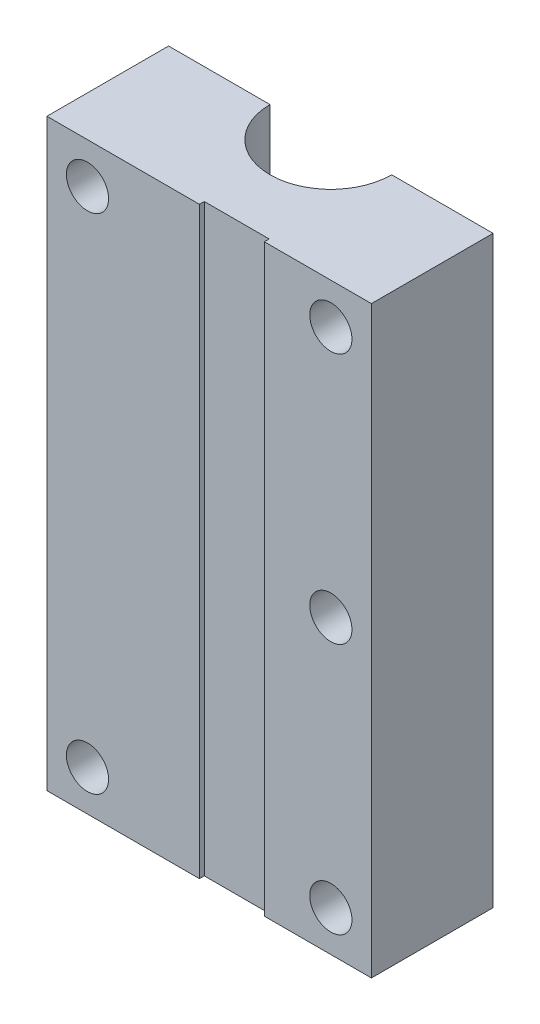
ISO-10303-21;
HEADER;
FILE_DESCRIPTION(('STEP AP214'),'2;1');
FILE_NAME('part.step','',(''),(''),'','','');
FILE_SCHEMA(('AUTOMOTIVE_DESIGN { 1 0 10303 214 1 1 1 1 }'));
ENDSEC;
DATA;
#1=APPLICATION_CONTEXT('core data for automotive mechanical design processes');
#2=APPLICATION_PROTOCOL_DEFINITION('international standard','automotive_design',2000,#1);
#3=PRODUCT_CONTEXT('',#1,'mechanical');
#4=PRODUCT('Part','Part','',(#3));
#5=PRODUCT_RELATED_PRODUCT_CATEGORY('part','',(#4));
#6=PRODUCT_DEFINITION_FORMATION('','',#4);
#7=PRODUCT_DEFINITION_CONTEXT('part definition',#1,'design');
#8=PRODUCT_DEFINITION('design','',#6,#7);
#9=PRODUCT_DEFINITION_SHAPE('','',#8);
#10=(LENGTH_UNIT() NAMED_UNIT(*) SI_UNIT(.MILLI.,.METRE.));
#11=(NAMED_UNIT(*) PLANE_ANGLE_UNIT() SI_UNIT($,.RADIAN.));
#12=(NAMED_UNIT(*) SI_UNIT($,.STERADIAN.) SOLID_ANGLE_UNIT());
#13=UNCERTAINTY_MEASURE_WITH_UNIT(LENGTH_MEASURE(1.E-05),#10,'distance_accuracy_value','');
#14=(GEOMETRIC_REPRESENTATION_CONTEXT(3) GLOBAL_UNCERTAINTY_ASSIGNED_CONTEXT((#13)) GLOBAL_UNIT_ASSIGNED_CONTEXT((#10,
#11,#12)) REPRESENTATION_CONTEXT('',''));
#15=CARTESIAN_POINT('',(0.,0.,0.));
#16=DIRECTION('',(0.,0.,1.));
#17=DIRECTION('',(1.,0.,0.));
#18=AXIS2_PLACEMENT_3D('',#15,#16,#17);
#19=CARTESIAN_POINT('',(0.,36.,0.));
#20=DIRECTION('',(0.,0.,-1.));
#21=DIRECTION('',(-1.,0.,0.));
#22=AXIS2_PLACEMENT_3D('',#19,#20,#21);
#23=PLANE('',#22);
#24=CARTESIAN_POINT('',(5.,-31.,0.));
#25=DIRECTION('',(0.,0.,1.));
#26=DIRECTION('',(1.,0.,0.));
#27=AXIS2_PLACEMENT_3D('',#24,#25,#26);
#28=CIRCLE('',#27,2.6);
#29=CARTESIAN_POINT('',(7.6,-31.,0.));
#30=VERTEX_POINT('',#29);
#31=EDGE_CURVE('E345',#30,#30,#28,.T.);
#32=ORIENTED_EDGE('',*,*,#31,.F.);
#33=EDGE_LOOP('',(#32));
#34=FACE_BOUND('',#33,.T.);
#35=CARTESIAN_POINT('',(5.,31.,0.));
#36=DIRECTION('',(0.,0.,1.));
#37=DIRECTION('',(1.,0.,0.));
#38=AXIS2_PLACEMENT_3D('',#35,#36,#37);
#39=CIRCLE('',#38,2.6);
#40=CARTESIAN_POINT('',(7.6,31.,0.));
#41=VERTEX_POINT('',#40);
#42=EDGE_CURVE('E359',#41,#41,#39,.T.);
#43=ORIENTED_EDGE('',*,*,#42,.F.);
#44=EDGE_LOOP('',(#43));
#45=FACE_BOUND('',#44,.T.);
#46=DIRECTION('',(1.,0.,0.));
#47=VECTOR('',#46,1.);
#48=CARTESIAN_POINT('',(0.,-36.,0.));
#49=LINE('',#48,#47);
#50=CARTESIAN_POINT('',(0.,-36.,0.));
#51=VERTEX_POINT('',#50);
#52=CARTESIAN_POINT('',(18.8,-36.,0.));
#53=VERTEX_POINT('',#52);
#54=EDGE_CURVE('E147',#51,#53,#49,.T.);
#55=ORIENTED_EDGE('',*,*,#54,.T.);
#56=DIRECTION('',(0.,-1.,0.));
#57=VECTOR('',#56,1.);
#58=CARTESIAN_POINT('',(18.8,38.3259144244949,0.));
#59=LINE('',#58,#57);
#60=CARTESIAN_POINT('',(18.8,36.,0.));
#61=VERTEX_POINT('',#60);
#62=EDGE_CURVE('E136',#61,#53,#59,.T.);
#63=ORIENTED_EDGE('',*,*,#62,.F.);
#64=DIRECTION('',(1.,0.,0.));
#65=VECTOR('',#64,1.);
#66=CARTESIAN_POINT('',(0.,36.,0.));
#67=LINE('',#66,#65);
#68=CARTESIAN_POINT('',(0.,36.,0.));
#69=VERTEX_POINT('',#68);
#70=EDGE_CURVE('E145',#69,#61,#67,.T.);
#71=ORIENTED_EDGE('',*,*,#70,.F.);
#72=DIRECTION('',(0.,-1.,0.));
#73=VECTOR('',#72,1.);
#74=CARTESIAN_POINT('',(0.,36.,0.));
#75=LINE('',#74,#73);
#76=EDGE_CURVE('E201',#69,#51,#75,.T.);
#77=ORIENTED_EDGE('',*,*,#76,.T.);
#78=EDGE_LOOP('',(#55,#63,#71,#77));
#79=FACE_BOUND('',#78,.T.);
#80=ADVANCED_FACE('F33',(#34,#45,#79),#23,.F.);
#81=CARTESIAN_POINT('',(27.5,36.,-15.));
#82=DIRECTION('',(0.,0.,1.));
#83=DIRECTION('',(1.,0.,0.));
#84=AXIS2_PLACEMENT_3D('',#81,#82,#83);
#85=PLANE('',#84);
#86=CARTESIAN_POINT('',(35.,0.,-15.));
#87=DIRECTION('',(0.,0.,1.));
#88=DIRECTION('',(1.,0.,0.));
#89=AXIS2_PLACEMENT_3D('',#86,#87,#88);
#90=CIRCLE('',#89,2.6);
#91=CARTESIAN_POINT('',(37.6,0.,-15.));
#92=VERTEX_POINT('',#91);
#93=EDGE_CURVE('E346',#92,#92,#90,.T.);
#94=ORIENTED_EDGE('',*,*,#93,.T.);
#95=EDGE_LOOP('',(#94));
#96=FACE_BOUND('',#95,.T.);
#97=CARTESIAN_POINT('',(35.,-31.,-15.));
#98=DIRECTION('',(0.,0.,1.));
#99=DIRECTION('',(1.,0.,0.));
#100=AXIS2_PLACEMENT_3D('',#97,#98,#99);
#101=CIRCLE('',#100,2.6);
#102=CARTESIAN_POINT('',(37.6,-31.,-15.));
#103=VERTEX_POINT('',#102);
#104=EDGE_CURVE('E363',#103,#103,#101,.T.);
#105=ORIENTED_EDGE('',*,*,#104,.T.);
#106=EDGE_LOOP('',(#105));
#107=FACE_BOUND('',#106,.T.);
#108=CARTESIAN_POINT('',(35.,31.,-15.));
#109=DIRECTION('',(0.,0.,1.));
#110=DIRECTION('',(1.,0.,0.));
#111=AXIS2_PLACEMENT_3D('',#108,#109,#110);
#112=CIRCLE('',#111,2.6);
#113=CARTESIAN_POINT('',(37.6,31.,-15.));
#114=VERTEX_POINT('',#113);
#115=EDGE_CURVE('E356',#114,#114,#112,.T.);
#116=ORIENTED_EDGE('',*,*,#115,.T.);
#117=EDGE_LOOP('',(#116));
#118=FACE_BOUND('',#117,.T.);
#119=DIRECTION('',(-1.,0.,0.));
#120=VECTOR('',#119,1.);
#121=CARTESIAN_POINT('',(8.45886159366972,-16.5,-15.));
#122=LINE('',#121,#120);
#123=CARTESIAN_POINT('',(31.4588615936697,-16.5,-15.));
#124=VERTEX_POINT('',#123);
#125=CARTESIAN_POINT('',(27.5,-16.5,-15.));
#126=VERTEX_POINT('',#125);
#127=EDGE_CURVE('E236',#124,#126,#122,.T.);
#128=ORIENTED_EDGE('',*,*,#127,.F.);
#129=DIRECTION('',(0.,1.,0.));
#130=VECTOR('',#129,1.);
#131=CARTESIAN_POINT('',(31.4588615936697,-16.5,-15.));
#132=LINE('',#131,#130);
#133=CARTESIAN_POINT('',(31.4588615936697,16.5,-15.));
#134=VERTEX_POINT('',#133);
#135=EDGE_CURVE('E239',#124,#134,#132,.T.);
#136=ORIENTED_EDGE('',*,*,#135,.T.);
#137=DIRECTION('',(-1.,0.,0.));
#138=VECTOR('',#137,1.);
#139=CARTESIAN_POINT('',(8.45886159366972,16.5,-15.));
#140=LINE('',#139,#138);
#141=CARTESIAN_POINT('',(27.5,16.5,-15.));
#142=VERTEX_POINT('',#141);
#143=EDGE_CURVE('E237',#134,#142,#140,.T.);
#144=ORIENTED_EDGE('',*,*,#143,.T.);
#145=DIRECTION('',(0.,-1.,0.));
#146=VECTOR('',#145,1.);
#147=CARTESIAN_POINT('',(27.5,36.,-15.));
#148=LINE('',#147,#146);
#149=CARTESIAN_POINT('',(27.5,36.,-15.));
#150=VERTEX_POINT('',#149);
#151=EDGE_CURVE('E192',#150,#142,#148,.T.);
#152=ORIENTED_EDGE('',*,*,#151,.F.);
#153=DIRECTION('',(-1.,0.,0.));
#154=VECTOR('',#153,1.);
#155=CARTESIAN_POINT('',(27.5,36.,-15.));
#156=LINE('',#155,#154);
#157=CARTESIAN_POINT('',(40.,36.,-15.));
#158=VERTEX_POINT('',#157);
#159=EDGE_CURVE('E158',#158,#150,#156,.T.);
#160=ORIENTED_EDGE('',*,*,#159,.F.);
#161=DIRECTION('',(0.,-1.,0.));
#162=VECTOR('',#161,1.);
#163=CARTESIAN_POINT('',(40.,36.,-15.));
#164=LINE('',#163,#162);
#165=CARTESIAN_POINT('',(40.,-36.,-15.));
#166=VERTEX_POINT('',#165);
#167=EDGE_CURVE('E195',#158,#166,#164,.T.);
#168=ORIENTED_EDGE('',*,*,#167,.T.);
#169=DIRECTION('',(-1.,0.,0.));
#170=VECTOR('',#169,1.);
#171=CARTESIAN_POINT('',(27.5,-36.,-15.));
#172=LINE('',#171,#170);
#173=CARTESIAN_POINT('',(27.5,-36.,-15.));
#174=VERTEX_POINT('',#173);
#175=EDGE_CURVE('E177',#166,#174,#172,.T.);
#176=ORIENTED_EDGE('',*,*,#175,.T.);
#177=EDGE_CURVE('E191',#126,#174,#148,.T.);
#178=ORIENTED_EDGE('',*,*,#177,.F.);
#179=EDGE_LOOP('',(#128,#136,#144,#152,#160,#168,#176,#178));
#180=FACE_BOUND('',#179,.T.);
#181=ADVANCED_FACE('F281',(#96,#107,#118,#180),#85,.F.);
#182=CARTESIAN_POINT('',(20.,36.,-15.));
#183=DIRECTION('',(0.,-1.,0.));
#184=DIRECTION('',(0.,0.,-1.));
#185=AXIS2_PLACEMENT_3D('',#182,#183,#184);
#186=CYLINDRICAL_SURFACE('',#185,7.5);
#187=CARTESIAN_POINT('',(20.,-16.5,-15.));
#188=DIRECTION('',(0.,1.,0.));
#189=DIRECTION('',(0.,0.,1.));
#190=AXIS2_PLACEMENT_3D('',#187,#188,#189);
#191=CIRCLE('',#190,7.5);
#192=CARTESIAN_POINT('',(12.5,-16.5,-15.));
#193=VERTEX_POINT('',#192);
#194=EDGE_CURVE('E173',#126,#193,#191,.F.);
#195=ORIENTED_EDGE('',*,*,#194,.F.);
#196=ORIENTED_EDGE('',*,*,#177,.T.);
#197=CARTESIAN_POINT('',(20.,-36.,-15.));
#198=DIRECTION('',(0.,-1.,0.));
#199=DIRECTION('',(0.,0.,1.));
#200=AXIS2_PLACEMENT_3D('',#197,#198,#199);
#201=CIRCLE('',#200,7.5);
#202=CARTESIAN_POINT('',(12.5,-36.,-15.));
#203=VERTEX_POINT('',#202);
#204=EDGE_CURVE('E180',#174,#203,#201,.T.);
#205=ORIENTED_EDGE('',*,*,#204,.T.);
#206=DIRECTION('',(0.,-1.,0.));
#207=VECTOR('',#206,1.);
#208=CARTESIAN_POINT('',(12.5,36.,-15.));
#209=LINE('',#208,#207);
#210=EDGE_CURVE('E187',#193,#203,#209,.T.);
#211=ORIENTED_EDGE('',*,*,#210,.F.);
#212=EDGE_LOOP('',(#195,#196,#205,#211));
#213=FACE_BOUND('',#212,.T.);
#214=ADVANCED_FACE('F261',(#213),#186,.F.);
#215=CARTESIAN_POINT('',(0.,36.,-15.));
#216=DIRECTION('',(0.,0.,1.));
#217=DIRECTION('',(1.,0.,0.));
#218=AXIS2_PLACEMENT_3D('',#215,#216,#217);
#219=PLANE('',#218);
#220=CARTESIAN_POINT('',(5.,-31.,-15.));
#221=DIRECTION('',(0.,0.,1.));
#222=DIRECTION('',(1.,0.,0.));
#223=AXIS2_PLACEMENT_3D('',#220,#221,#222);
#224=CIRCLE('',#223,2.6);
#225=CARTESIAN_POINT('',(7.6,-31.,-15.));
#226=VERTEX_POINT('',#225);
#227=EDGE_CURVE('E343',#226,#226,#224,.T.);
#228=ORIENTED_EDGE('',*,*,#227,.T.);
#229=EDGE_LOOP('',(#228));
#230=FACE_BOUND('',#229,.T.);
#231=CARTESIAN_POINT('',(5.,31.,-15.));
#232=DIRECTION('',(0.,0.,1.));
#233=DIRECTION('',(1.,0.,0.));
#234=AXIS2_PLACEMENT_3D('',#231,#232,#233);
#235=CIRCLE('',#234,2.6);
#236=CARTESIAN_POINT('',(7.6,31.,-15.));
#237=VERTEX_POINT('',#236);
#238=EDGE_CURVE('E149',#237,#237,#235,.T.);
#239=ORIENTED_EDGE('',*,*,#238,.T.);
#240=EDGE_LOOP('',(#239));
#241=FACE_BOUND('',#240,.T.);
#242=DIRECTION('',(-1.,0.,0.));
#243=VECTOR('',#242,1.);
#244=CARTESIAN_POINT('',(0.,-16.5,-15.));
#245=LINE('',#244,#243);
#246=CARTESIAN_POINT('',(8.45886159366972,-16.5,-15.));
#247=VERTEX_POINT('',#246);
#248=EDGE_CURVE('E206',#193,#247,#245,.T.);
#249=ORIENTED_EDGE('',*,*,#248,.F.);
#250=ORIENTED_EDGE('',*,*,#210,.T.);
#251=DIRECTION('',(-1.,0.,0.));
#252=VECTOR('',#251,1.);
#253=CARTESIAN_POINT('',(0.,-36.,-15.));
#254=LINE('',#253,#252);
#255=CARTESIAN_POINT('',(0.,-36.,-15.));
#256=VERTEX_POINT('',#255);
#257=EDGE_CURVE('E183',#203,#256,#254,.T.);
#258=ORIENTED_EDGE('',*,*,#257,.T.);
#259=DIRECTION('',(0.,-1.,0.));
#260=VECTOR('',#259,1.);
#261=CARTESIAN_POINT('',(0.,36.,-15.));
#262=LINE('',#261,#260);
#263=CARTESIAN_POINT('',(0.,36.,-15.));
#264=VERTEX_POINT('',#263);
#265=EDGE_CURVE('E168',#264,#256,#262,.T.);
#266=ORIENTED_EDGE('',*,*,#265,.F.);
#267=DIRECTION('',(-1.,0.,0.));
#268=VECTOR('',#267,1.);
#269=CARTESIAN_POINT('',(0.,36.,-15.));
#270=LINE('',#269,#268);
#271=CARTESIAN_POINT('',(12.5,36.,-15.));
#272=VERTEX_POINT('',#271);
#273=EDGE_CURVE('E166',#272,#264,#270,.T.);
#274=ORIENTED_EDGE('',*,*,#273,.F.);
#275=CARTESIAN_POINT('',(12.5,16.5,-15.));
#276=VERTEX_POINT('',#275);
#277=EDGE_CURVE('E188',#272,#276,#209,.T.);
#278=ORIENTED_EDGE('',*,*,#277,.T.);
#279=DIRECTION('',(-1.,0.,0.));
#280=VECTOR('',#279,1.);
#281=CARTESIAN_POINT('',(0.,16.5,-15.));
#282=LINE('',#281,#280);
#283=CARTESIAN_POINT('',(8.45886159366972,16.5,-15.));
#284=VERTEX_POINT('',#283);
#285=EDGE_CURVE('E203',#276,#284,#282,.T.);
#286=ORIENTED_EDGE('',*,*,#285,.T.);
#287=DIRECTION('',(0.,1.,0.));
#288=VECTOR('',#287,1.);
#289=CARTESIAN_POINT('',(8.45886159366972,-16.5,-15.));
#290=LINE('',#289,#288);
#291=EDGE_CURVE('E243',#247,#284,#290,.T.);
#292=ORIENTED_EDGE('',*,*,#291,.F.);
#293=EDGE_LOOP('',(#249,#250,#258,#266,#274,#278,#286,#292));
#294=FACE_BOUND('',#293,.T.);
#295=ADVANCED_FACE('F260',(#230,#241,#294),#219,.F.);
#296=CARTESIAN_POINT('',(0.,36.,0.));
#297=DIRECTION('',(1.,0.,0.));
#298=DIRECTION('',(0.,0.,-1.));
#299=AXIS2_PLACEMENT_3D('',#296,#297,#298);
#300=PLANE('',#299);
#301=DIRECTION('',(0.,0.,1.));
#302=VECTOR('',#301,1.);
#303=CARTESIAN_POINT('',(0.,-36.,0.));
#304=LINE('',#303,#302);
#305=EDGE_CURVE('E169',#256,#51,#304,.T.);
#306=ORIENTED_EDGE('',*,*,#305,.T.);
#307=ORIENTED_EDGE('',*,*,#76,.F.);
#308=DIRECTION('',(0.,0.,1.));
#309=VECTOR('',#308,1.);
#310=CARTESIAN_POINT('',(0.,36.,0.));
#311=LINE('',#310,#309);
#312=EDGE_CURVE('E153',#264,#69,#311,.T.);
#313=ORIENTED_EDGE('',*,*,#312,.F.);
#314=ORIENTED_EDGE('',*,*,#265,.T.);
#315=EDGE_LOOP('',(#306,#307,#313,#314));
#316=FACE_BOUND('',#315,.T.);
#317=ADVANCED_FACE('F35',(#316),#300,.F.);
#318=CARTESIAN_POINT('',(35.,0.,0.));
#319=DIRECTION('',(0.,0.,1.));
#320=DIRECTION('',(1.,0.,0.));
#321=AXIS2_PLACEMENT_3D('',#318,#319,#320);
#322=CIRCLE('',#321,2.6);
#323=CARTESIAN_POINT('',(37.6,0.,0.));
#324=VERTEX_POINT('',#323);
#325=EDGE_CURVE('E351',#324,#324,#322,.T.);
#326=ORIENTED_EDGE('',*,*,#325,.F.);
#327=EDGE_LOOP('',(#326));
#328=FACE_BOUND('',#327,.T.);
#329=CARTESIAN_POINT('',(35.,-31.,0.));
#330=DIRECTION('',(0.,0.,1.));
#331=DIRECTION('',(1.,0.,0.));
#332=AXIS2_PLACEMENT_3D('',#329,#330,#331);
#333=CIRCLE('',#332,2.6);
#334=CARTESIAN_POINT('',(37.6,-31.,0.));
#335=VERTEX_POINT('',#334);
#336=EDGE_CURVE('E348',#335,#335,#333,.T.);
#337=ORIENTED_EDGE('',*,*,#336,.F.);
#338=EDGE_LOOP('',(#337));
#339=FACE_BOUND('',#338,.T.);
#340=CARTESIAN_POINT('',(35.,31.,0.));
#341=DIRECTION('',(0.,0.,1.));
#342=DIRECTION('',(1.,0.,0.));
#343=AXIS2_PLACEMENT_3D('',#340,#341,#342);
#344=CIRCLE('',#343,2.6);
#345=CARTESIAN_POINT('',(37.6,31.,0.));
#346=VERTEX_POINT('',#345);
#347=EDGE_CURVE('E360',#346,#346,#344,.T.);
#348=ORIENTED_EDGE('',*,*,#347,.F.);
#349=EDGE_LOOP('',(#348));
#350=FACE_BOUND('',#349,.T.);
#351=CARTESIAN_POINT('',(26.8,36.,0.));
#352=VERTEX_POINT('',#351);
#353=CARTESIAN_POINT('',(40.,36.,0.));
#354=VERTEX_POINT('',#353);
#355=EDGE_CURVE('E156',#352,#354,#67,.T.);
#356=ORIENTED_EDGE('',*,*,#355,.F.);
#357=DIRECTION('',(0.,1.,0.));
#358=VECTOR('',#357,1.);
#359=CARTESIAN_POINT('',(26.8,38.3259144244949,0.));
#360=LINE('',#359,#358);
#361=CARTESIAN_POINT('',(26.8,-36.,0.));
#362=VERTEX_POINT('',#361);
#363=EDGE_CURVE('E148',#362,#352,#360,.T.);
#364=ORIENTED_EDGE('',*,*,#363,.F.);
#365=CARTESIAN_POINT('',(40.,-36.,0.));
#366=VERTEX_POINT('',#365);
#367=EDGE_CURVE('E172',#362,#366,#49,.T.);
#368=ORIENTED_EDGE('',*,*,#367,.T.);
#369=DIRECTION('',(0.,-1.,0.));
#370=VECTOR('',#369,1.);
#371=CARTESIAN_POINT('',(40.,36.,0.));
#372=LINE('',#371,#370);
#373=EDGE_CURVE('E198',#354,#366,#372,.T.);
#374=ORIENTED_EDGE('',*,*,#373,.F.);
#375=EDGE_LOOP('',(#356,#364,#368,#374));
#376=FACE_BOUND('',#375,.T.);
#377=ADVANCED_FACE('F224',(#328,#339,#350,#376),#23,.F.);
#378=CARTESIAN_POINT('',(40.,36.,0.));
#379=DIRECTION('',(-1.,0.,0.));
#380=DIRECTION('',(0.,0.,1.));
#381=AXIS2_PLACEMENT_3D('',#378,#379,#380);
#382=PLANE('',#381);
#383=DIRECTION('',(0.,0.,-1.));
#384=VECTOR('',#383,1.);
#385=CARTESIAN_POINT('',(40.,-36.,0.));
#386=LINE('',#385,#384);
#387=EDGE_CURVE('E175',#366,#166,#386,.T.);
#388=ORIENTED_EDGE('',*,*,#387,.T.);
#389=ORIENTED_EDGE('',*,*,#167,.F.);
#390=DIRECTION('',(0.,0.,-1.));
#391=VECTOR('',#390,1.);
#392=CARTESIAN_POINT('',(40.,36.,0.));
#393=LINE('',#392,#391);
#394=EDGE_CURVE('E155',#354,#158,#393,.T.);
#395=ORIENTED_EDGE('',*,*,#394,.F.);
#396=ORIENTED_EDGE('',*,*,#373,.T.);
#397=EDGE_LOOP('',(#388,#389,#395,#396));
#398=FACE_BOUND('',#397,.T.);
#399=ADVANCED_FACE('F275',(#398),#382,.F.);
#400=ORIENTED_EDGE('',*,*,#151,.T.);
#401=CARTESIAN_POINT('',(20.,16.5,-15.));
#402=DIRECTION('',(0.,1.,0.));
#403=DIRECTION('',(0.,0.,1.));
#404=AXIS2_PLACEMENT_3D('',#401,#402,#403);
#405=CIRCLE('',#404,7.5);
#406=EDGE_CURVE('E245',#142,#276,#405,.F.);
#407=ORIENTED_EDGE('',*,*,#406,.T.);
#408=ORIENTED_EDGE('',*,*,#277,.F.);
#409=CARTESIAN_POINT('',(20.,36.,-15.));
#410=DIRECTION('',(0.,-1.,0.));
#411=DIRECTION('',(0.,0.,1.));
#412=AXIS2_PLACEMENT_3D('',#409,#410,#411);
#413=CIRCLE('',#412,7.5);
#414=EDGE_CURVE('E164',#150,#272,#413,.T.);
#415=ORIENTED_EDGE('',*,*,#414,.F.);
#416=EDGE_LOOP('',(#400,#407,#408,#415));
#417=FACE_BOUND('',#416,.T.);
#418=ADVANCED_FACE('F293',(#417),#186,.F.);
#419=CARTESIAN_POINT('',(20.,36.,-15.));
#420=DIRECTION('',(0.,1.,0.));
#421=DIRECTION('',(0.,0.,1.));
#422=AXIS2_PLACEMENT_3D('',#419,#420,#421);
#423=PLANE('',#422);
#424=DIRECTION('',(0.,0.,1.));
#425=VECTOR('',#424,1.);
#426=CARTESIAN_POINT('',(18.8,36.,-15.));
#427=LINE('',#426,#425);
#428=CARTESIAN_POINT('',(18.8,36.,-0.6));
#429=VERTEX_POINT('',#428);
#430=EDGE_CURVE('E133',#429,#61,#427,.T.);
#431=ORIENTED_EDGE('',*,*,#430,.F.);
#432=DIRECTION('',(1.,0.,0.));
#433=VECTOR('',#432,1.);
#434=CARTESIAN_POINT('',(20.,36.,-0.6));
#435=LINE('',#434,#433);
#436=CARTESIAN_POINT('',(26.8,36.,-0.6));
#437=VERTEX_POINT('',#436);
#438=EDGE_CURVE('E230',#429,#437,#435,.T.);
#439=ORIENTED_EDGE('',*,*,#438,.T.);
#440=DIRECTION('',(0.,0.,-1.));
#441=VECTOR('',#440,1.);
#442=CARTESIAN_POINT('',(26.8,36.,-15.));
#443=LINE('',#442,#441);
#444=EDGE_CURVE('E140',#352,#437,#443,.T.);
#445=ORIENTED_EDGE('',*,*,#444,.F.);
#446=ORIENTED_EDGE('',*,*,#355,.T.);
#447=ORIENTED_EDGE('',*,*,#394,.T.);
#448=ORIENTED_EDGE('',*,*,#159,.T.);
#449=ORIENTED_EDGE('',*,*,#414,.T.);
#450=ORIENTED_EDGE('',*,*,#273,.T.);
#451=ORIENTED_EDGE('',*,*,#312,.T.);
#452=ORIENTED_EDGE('',*,*,#70,.T.);
#453=EDGE_LOOP('',(#431,#439,#445,#446,#447,#448,#449,#450,#451,#452));
#454=FACE_BOUND('',#453,.T.);
#455=ADVANCED_FACE('F151',(#454),#423,.T.);
#456=CARTESIAN_POINT('',(20.,-36.,-15.));
#457=DIRECTION('',(0.,1.,0.));
#458=DIRECTION('',(0.,0.,1.));
#459=AXIS2_PLACEMENT_3D('',#456,#457,#458);
#460=PLANE('',#459);
#461=DIRECTION('',(1.,0.,0.));
#462=VECTOR('',#461,1.);
#463=CARTESIAN_POINT('',(20.,-36.,-0.6));
#464=LINE('',#463,#462);
#465=CARTESIAN_POINT('',(18.8,-36.,-0.6));
#466=VERTEX_POINT('',#465);
#467=CARTESIAN_POINT('',(26.8,-36.,-0.6));
#468=VERTEX_POINT('',#467);
#469=EDGE_CURVE('E208',#466,#468,#464,.T.);
#470=ORIENTED_EDGE('',*,*,#469,.F.);
#471=DIRECTION('',(0.,0.,1.));
#472=VECTOR('',#471,1.);
#473=CARTESIAN_POINT('',(18.8,-36.,-15.));
#474=LINE('',#473,#472);
#475=EDGE_CURVE('E11',#466,#53,#474,.T.);
#476=ORIENTED_EDGE('',*,*,#475,.T.);
#477=ORIENTED_EDGE('',*,*,#54,.F.);
#478=ORIENTED_EDGE('',*,*,#305,.F.);
#479=ORIENTED_EDGE('',*,*,#257,.F.);
#480=ORIENTED_EDGE('',*,*,#204,.F.);
#481=ORIENTED_EDGE('',*,*,#175,.F.);
#482=ORIENTED_EDGE('',*,*,#387,.F.);
#483=ORIENTED_EDGE('',*,*,#367,.F.);
#484=DIRECTION('',(0.,0.,-1.));
#485=VECTOR('',#484,1.);
#486=CARTESIAN_POINT('',(26.8,-36.,-15.));
#487=LINE('',#486,#485);
#488=EDGE_CURVE('E41',#362,#468,#487,.T.);
#489=ORIENTED_EDGE('',*,*,#488,.T.);
#490=EDGE_LOOP('',(#470,#476,#477,#478,#479,#480,#481,#482,#483,#489));
#491=FACE_BOUND('',#490,.T.);
#492=ADVANCED_FACE('F213',(#491),#460,.F.);
#493=CARTESIAN_POINT('',(19.9588615936697,-16.5,-15.));
#494=DIRECTION('',(0.,1.,0.));
#495=DIRECTION('',(0.,0.,1.));
#496=AXIS2_PLACEMENT_3D('',#493,#494,#495);
#497=PLANE('',#496);
#498=ORIENTED_EDGE('',*,*,#194,.T.);
#499=ORIENTED_EDGE('',*,*,#248,.T.);
#500=CARTESIAN_POINT('',(19.9588615936697,-16.5,-15.));
#501=DIRECTION('',(0.,1.,0.));
#502=DIRECTION('',(0.,0.,1.));
#503=AXIS2_PLACEMENT_3D('',#500,#501,#502);
#504=CIRCLE('',#503,11.5);
#505=EDGE_CURVE('E233',#247,#124,#504,.T.);
#506=ORIENTED_EDGE('',*,*,#505,.T.);
#507=ORIENTED_EDGE('',*,*,#127,.T.);
#508=EDGE_LOOP('',(#498,#499,#506,#507));
#509=FACE_BOUND('',#508,.T.);
#510=ADVANCED_FACE('F252',(#509),#497,.T.);
#511=CARTESIAN_POINT('',(19.9588615936697,16.5,-15.));
#512=DIRECTION('',(0.,1.,0.));
#513=DIRECTION('',(0.,0.,1.));
#514=AXIS2_PLACEMENT_3D('',#511,#512,#513);
#515=PLANE('',#514);
#516=ORIENTED_EDGE('',*,*,#143,.F.);
#517=CARTESIAN_POINT('',(19.9588615936697,16.5,-15.));
#518=DIRECTION('',(0.,1.,0.));
#519=DIRECTION('',(0.,0.,1.));
#520=AXIS2_PLACEMENT_3D('',#517,#518,#519);
#521=CIRCLE('',#520,11.5);
#522=EDGE_CURVE('E56',#284,#134,#521,.T.);
#523=ORIENTED_EDGE('',*,*,#522,.F.);
#524=ORIENTED_EDGE('',*,*,#285,.F.);
#525=ORIENTED_EDGE('',*,*,#406,.F.);
#526=EDGE_LOOP('',(#516,#523,#524,#525));
#527=FACE_BOUND('',#526,.T.);
#528=ADVANCED_FACE('F306',(#527),#515,.F.);
#529=CARTESIAN_POINT('',(19.9588615936697,-16.5,-15.));
#530=DIRECTION('',(0.,1.,0.));
#531=DIRECTION('',(0.,0.,1.));
#532=AXIS2_PLACEMENT_3D('',#529,#530,#531);
#533=CYLINDRICAL_SURFACE('',#532,11.5);
#534=ORIENTED_EDGE('',*,*,#522,.T.);
#535=ORIENTED_EDGE('',*,*,#135,.F.);
#536=ORIENTED_EDGE('',*,*,#505,.F.);
#537=ORIENTED_EDGE('',*,*,#291,.T.);
#538=EDGE_LOOP('',(#534,#535,#536,#537));
#539=FACE_BOUND('',#538,.T.);
#540=ADVANCED_FACE('F303',(#539),#533,.F.);
#541=CARTESIAN_POINT('',(18.8,38.3259144244949,-0.6));
#542=DIRECTION('',(-1.,0.,0.));
#543=DIRECTION('',(0.,-1.,0.));
#544=AXIS2_PLACEMENT_3D('',#541,#542,#543);
#545=PLANE('',#544);
#546=ORIENTED_EDGE('',*,*,#430,.T.);
#547=ORIENTED_EDGE('',*,*,#62,.T.);
#548=ORIENTED_EDGE('',*,*,#475,.F.);
#549=DIRECTION('',(0.,-1.,0.));
#550=VECTOR('',#549,1.);
#551=CARTESIAN_POINT('',(18.8,38.3259144244949,-0.6));
#552=LINE('',#551,#550);
#553=EDGE_CURVE('E48',#429,#466,#552,.T.);
#554=ORIENTED_EDGE('',*,*,#553,.F.);
#555=EDGE_LOOP('',(#546,#547,#548,#554));
#556=FACE_BOUND('',#555,.T.);
#557=ADVANCED_FACE('F135',(#556),#545,.F.);
#558=CARTESIAN_POINT('',(26.8,38.3259144244949,-0.6));
#559=DIRECTION('',(1.,0.,0.));
#560=DIRECTION('',(0.,1.,0.));
#561=AXIS2_PLACEMENT_3D('',#558,#559,#560);
#562=PLANE('',#561);
#563=ORIENTED_EDGE('',*,*,#444,.T.);
#564=DIRECTION('',(0.,1.,0.));
#565=VECTOR('',#564,1.);
#566=CARTESIAN_POINT('',(26.8,38.3259144244949,-0.6));
#567=LINE('',#566,#565);
#568=EDGE_CURVE('E221',#468,#437,#567,.T.);
#569=ORIENTED_EDGE('',*,*,#568,.F.);
#570=ORIENTED_EDGE('',*,*,#488,.F.);
#571=ORIENTED_EDGE('',*,*,#363,.T.);
#572=EDGE_LOOP('',(#563,#569,#570,#571));
#573=FACE_BOUND('',#572,.T.);
#574=ADVANCED_FACE('F218',(#573),#562,.F.);
#575=CARTESIAN_POINT('',(0.,0.,-0.6));
#576=DIRECTION('',(0.,0.,1.));
#577=DIRECTION('',(1.,0.,0.));
#578=AXIS2_PLACEMENT_3D('',#575,#576,#577);
#579=PLANE('',#578);
#580=ORIENTED_EDGE('',*,*,#553,.T.);
#581=ORIENTED_EDGE('',*,*,#469,.T.);
#582=ORIENTED_EDGE('',*,*,#568,.T.);
#583=ORIENTED_EDGE('',*,*,#438,.F.);
#584=EDGE_LOOP('',(#580,#581,#582,#583));
#585=FACE_BOUND('',#584,.T.);
#586=ADVANCED_FACE('F316',(#585),#579,.T.);
#587=CARTESIAN_POINT('',(5.,31.,-15.));
#588=DIRECTION('',(0.,0.,1.));
#589=DIRECTION('',(1.,0.,0.));
#590=AXIS2_PLACEMENT_3D('',#587,#588,#589);
#591=CYLINDRICAL_SURFACE('',#590,2.6);
#592=CARTESIAN_POINT('',(7.6,31.,-15.));
#593=CARTESIAN_POINT('',(7.6,31.,-14.84375));
#594=CARTESIAN_POINT('',(7.6,31.,-14.6875));
#595=CARTESIAN_POINT('',(7.6,31.,-14.375));
#596=CARTESIAN_POINT('',(7.6,31.,-14.21875));
#597=CARTESIAN_POINT('',(7.6,31.,-13.90625));
#598=CARTESIAN_POINT('',(7.6,31.,-13.75));
#599=CARTESIAN_POINT('',(7.6,31.,-13.4375));
#600=CARTESIAN_POINT('',(7.6,31.,-13.28125));
#601=CARTESIAN_POINT('',(7.6,31.,-12.96875));
#602=CARTESIAN_POINT('',(7.6,31.,-12.8125));
#603=CARTESIAN_POINT('',(7.6,31.,-12.5));
#604=CARTESIAN_POINT('',(7.6,31.,-12.34375));
#605=CARTESIAN_POINT('',(7.6,31.,-12.03125));
#606=CARTESIAN_POINT('',(7.6,31.,-11.875));
#607=CARTESIAN_POINT('',(7.6,31.,-11.5625));
#608=CARTESIAN_POINT('',(7.6,31.,-11.40625));
#609=CARTESIAN_POINT('',(7.6,31.,-11.09375));
#610=CARTESIAN_POINT('',(7.6,31.,-10.9375));
#611=CARTESIAN_POINT('',(7.6,31.,-10.625));
#612=CARTESIAN_POINT('',(7.6,31.,-10.46875));
#613=CARTESIAN_POINT('',(7.6,31.,-10.15625));
#614=CARTESIAN_POINT('',(7.6,31.,-10.));
#615=CARTESIAN_POINT('',(7.6,31.,-9.6875));
#616=CARTESIAN_POINT('',(7.6,31.,-9.53125));
#617=CARTESIAN_POINT('',(7.6,31.,-9.21875));
#618=CARTESIAN_POINT('',(7.6,31.,-9.0625));
#619=CARTESIAN_POINT('',(7.6,31.,-8.75));
#620=CARTESIAN_POINT('',(7.6,31.,-8.59375));
#621=CARTESIAN_POINT('',(7.6,31.,-8.28125));
#622=CARTESIAN_POINT('',(7.6,31.,-8.125));
#623=CARTESIAN_POINT('',(7.6,31.,-7.8125));
#624=CARTESIAN_POINT('',(7.6,31.,-7.65625));
#625=CARTESIAN_POINT('',(7.6,31.,-7.34375));
#626=CARTESIAN_POINT('',(7.6,31.,-7.1875));
#627=CARTESIAN_POINT('',(7.6,31.,-6.875));
#628=CARTESIAN_POINT('',(7.6,31.,-6.71875));
#629=CARTESIAN_POINT('',(7.6,31.,-6.40625));
#630=CARTESIAN_POINT('',(7.6,31.,-6.25));
#631=CARTESIAN_POINT('',(7.6,31.,-5.9375));
#632=CARTESIAN_POINT('',(7.6,31.,-5.78125));
#633=CARTESIAN_POINT('',(7.6,31.,-5.46875));
#634=CARTESIAN_POINT('',(7.6,31.,-5.3125));
#635=CARTESIAN_POINT('',(7.6,31.,-5.));
#636=CARTESIAN_POINT('',(7.6,31.,-4.84375));
#637=CARTESIAN_POINT('',(7.6,31.,-4.53125));
#638=CARTESIAN_POINT('',(7.6,31.,-4.375));
#639=CARTESIAN_POINT('',(7.6,31.,-4.0625));
#640=CARTESIAN_POINT('',(7.6,31.,-3.90625));
#641=CARTESIAN_POINT('',(7.6,31.,-3.59375));
#642=CARTESIAN_POINT('',(7.6,31.,-3.4375));
#643=CARTESIAN_POINT('',(7.6,31.,-3.125));
#644=CARTESIAN_POINT('',(7.6,31.,-2.96875));
#645=CARTESIAN_POINT('',(7.6,31.,-2.65625));
#646=CARTESIAN_POINT('',(7.6,31.,-2.5));
#647=CARTESIAN_POINT('',(7.6,31.,-2.1875));
#648=CARTESIAN_POINT('',(7.6,31.,-2.03125));
#649=CARTESIAN_POINT('',(7.6,31.,-1.71875));
#650=CARTESIAN_POINT('',(7.6,31.,-1.5625));
#651=CARTESIAN_POINT('',(7.6,31.,-1.25));
#652=CARTESIAN_POINT('',(7.6,31.,-1.09375));
#653=CARTESIAN_POINT('',(7.6,31.,-0.781250000000001));
#654=CARTESIAN_POINT('',(7.6,31.,-0.625000000000001));
#655=CARTESIAN_POINT('',(7.6,31.,-0.3125));
#656=CARTESIAN_POINT('',(7.6,31.,-0.15625));
#657=CARTESIAN_POINT('',(7.6,31.,0.));
#658=B_SPLINE_CURVE_WITH_KNOTS('',3,(#592,#593,#594,#595,#596,#597,#598,#599,#600,#601,#602,
#603,#604,#605,#606,#607,#608,#609,#610,#611,#612,#613,#614,#615,#616,#617,#618,#619,#620,#621,
#622,#623,#624,#625,#626,#627,#628,#629,#630,#631,#632,#633,#634,#635,#636,#637,#638,#639,#640,
#641,#642,#643,#644,#645,#646,#647,#648,#649,#650,#651,#652,#653,#654,#655,#656,#657),
.UNSPECIFIED.,.F.,.F.,(4,2,2,2,2,2,2,2,2,2,2,2,2,2,2,2,2,2,2,2,2,2,2,2,2,2,2,2,2,2,2,2,4),(0.,
0.468749999999999,0.937499999999999,1.40625,1.875,2.34375,2.8125,3.28125,3.75,4.21875,4.6875,
5.15625,5.625,6.09375,6.5625,7.03125,7.5,7.96875,8.4375,8.90625,9.375,9.84375,10.3125,10.78125,
11.25,11.71875,12.1875,12.65625,13.125,13.59375,14.0625,14.53125,15.),.UNSPECIFIED.);
#659=EDGE_CURVE('BSEAM319',#237,#41,#658,.T.);
#660=ORIENTED_EDGE('',*,*,#238,.F.);
#661=ORIENTED_EDGE('',*,*,#42,.T.);
#662=ORIENTED_EDGE('',*,*,#659,.T.);
#663=ORIENTED_EDGE('',*,*,#659,.F.);
#664=EDGE_LOOP('',(#660,#662,#661,#663));
#665=FACE_BOUND('',#664,.T.);
#666=ADVANCED_FACE('F319',(#665),#591,.F.);
#667=CARTESIAN_POINT('',(35.,31.,-15.));
#668=DIRECTION('',(0.,0.,1.));
#669=DIRECTION('',(1.,0.,0.));
#670=AXIS2_PLACEMENT_3D('',#667,#668,#669);
#671=CYLINDRICAL_SURFACE('',#670,2.6);
#672=CARTESIAN_POINT('',(37.6,31.,-15.));
#673=CARTESIAN_POINT('',(37.6,31.,-14.84375));
#674=CARTESIAN_POINT('',(37.6,31.,-14.6875));
#675=CARTESIAN_POINT('',(37.6,31.,-14.375));
#676=CARTESIAN_POINT('',(37.6,31.,-14.21875));
#677=CARTESIAN_POINT('',(37.6,31.,-13.90625));
#678=CARTESIAN_POINT('',(37.6,31.,-13.75));
#679=CARTESIAN_POINT('',(37.6,31.,-13.4375));
#680=CARTESIAN_POINT('',(37.6,31.,-13.28125));
#681=CARTESIAN_POINT('',(37.6,31.,-12.96875));
#682=CARTESIAN_POINT('',(37.6,31.,-12.8125));
#683=CARTESIAN_POINT('',(37.6,31.,-12.5));
#684=CARTESIAN_POINT('',(37.6,31.,-12.34375));
#685=CARTESIAN_POINT('',(37.6,31.,-12.03125));
#686=CARTESIAN_POINT('',(37.6,31.,-11.875));
#687=CARTESIAN_POINT('',(37.6,31.,-11.5625));
#688=CARTESIAN_POINT('',(37.6,31.,-11.40625));
#689=CARTESIAN_POINT('',(37.6,31.,-11.09375));
#690=CARTESIAN_POINT('',(37.6,31.,-10.9375));
#691=CARTESIAN_POINT('',(37.6,31.,-10.625));
#692=CARTESIAN_POINT('',(37.6,31.,-10.46875));
#693=CARTESIAN_POINT('',(37.6,31.,-10.15625));
#694=CARTESIAN_POINT('',(37.6,31.,-10.));
#695=CARTESIAN_POINT('',(37.6,31.,-9.6875));
#696=CARTESIAN_POINT('',(37.6,31.,-9.53125));
#697=CARTESIAN_POINT('',(37.6,31.,-9.21875));
#698=CARTESIAN_POINT('',(37.6,31.,-9.0625));
#699=CARTESIAN_POINT('',(37.6,31.,-8.75));
#700=CARTESIAN_POINT('',(37.6,31.,-8.59375));
#701=CARTESIAN_POINT('',(37.6,31.,-8.28125));
#702=CARTESIAN_POINT('',(37.6,31.,-8.125));
#703=CARTESIAN_POINT('',(37.6,31.,-7.8125));
#704=CARTESIAN_POINT('',(37.6,31.,-7.65625));
#705=CARTESIAN_POINT('',(37.6,31.,-7.34375));
#706=CARTESIAN_POINT('',(37.6,31.,-7.1875));
#707=CARTESIAN_POINT('',(37.6,31.,-6.875));
#708=CARTESIAN_POINT('',(37.6,31.,-6.71875));
#709=CARTESIAN_POINT('',(37.6,31.,-6.40625));
#710=CARTESIAN_POINT('',(37.6,31.,-6.25));
#711=CARTESIAN_POINT('',(37.6,31.,-5.9375));
#712=CARTESIAN_POINT('',(37.6,31.,-5.78125));
#713=CARTESIAN_POINT('',(37.6,31.,-5.46875));
#714=CARTESIAN_POINT('',(37.6,31.,-5.3125));
#715=CARTESIAN_POINT('',(37.6,31.,-5.));
#716=CARTESIAN_POINT('',(37.6,31.,-4.84375));
#717=CARTESIAN_POINT('',(37.6,31.,-4.53125));
#718=CARTESIAN_POINT('',(37.6,31.,-4.375));
#719=CARTESIAN_POINT('',(37.6,31.,-4.0625));
#720=CARTESIAN_POINT('',(37.6,31.,-3.90625));
#721=CARTESIAN_POINT('',(37.6,31.,-3.59375));
#722=CARTESIAN_POINT('',(37.6,31.,-3.4375));
#723=CARTESIAN_POINT('',(37.6,31.,-3.125));
#724=CARTESIAN_POINT('',(37.6,31.,-2.96875));
#725=CARTESIAN_POINT('',(37.6,31.,-2.65625));
#726=CARTESIAN_POINT('',(37.6,31.,-2.5));
#727=CARTESIAN_POINT('',(37.6,31.,-2.1875));
#728=CARTESIAN_POINT('',(37.6,31.,-2.03125));
#729=CARTESIAN_POINT('',(37.6,31.,-1.71875));
#730=CARTESIAN_POINT('',(37.6,31.,-1.5625));
#731=CARTESIAN_POINT('',(37.6,31.,-1.25));
#732=CARTESIAN_POINT('',(37.6,31.,-1.09375));
#733=CARTESIAN_POINT('',(37.6,31.,-0.781250000000001));
#734=CARTESIAN_POINT('',(37.6,31.,-0.625000000000001));
#735=CARTESIAN_POINT('',(37.6,31.,-0.3125));
#736=CARTESIAN_POINT('',(37.6,31.,-0.15625));
#737=CARTESIAN_POINT('',(37.6,31.,0.));
#738=B_SPLINE_CURVE_WITH_KNOTS('',3,(#672,#673,#674,#675,#676,#677,#678,#679,#680,#681,#682,
#683,#684,#685,#686,#687,#688,#689,#690,#691,#692,#693,#694,#695,#696,#697,#698,#699,#700,#701,
#702,#703,#704,#705,#706,#707,#708,#709,#710,#711,#712,#713,#714,#715,#716,#717,#718,#719,#720,
#721,#722,#723,#724,#725,#726,#727,#728,#729,#730,#731,#732,#733,#734,#735,#736,#737),
.UNSPECIFIED.,.F.,.F.,(4,2,2,2,2,2,2,2,2,2,2,2,2,2,2,2,2,2,2,2,2,2,2,2,2,2,2,2,2,2,2,2,4),(0.,
0.468749999999999,0.937499999999999,1.40625,1.875,2.34375,2.8125,3.28125,3.75,4.21875,4.6875,
5.15625,5.625,6.09375,6.5625,7.03125,7.5,7.96875,8.4375,8.90625,9.375,9.84375,10.3125,10.78125,
11.25,11.71875,12.1875,12.65625,13.125,13.59375,14.0625,14.53125,15.),.UNSPECIFIED.);
#739=EDGE_CURVE('BSEAM322',#114,#346,#738,.T.);
#740=ORIENTED_EDGE('',*,*,#115,.F.);
#741=ORIENTED_EDGE('',*,*,#347,.T.);
#742=ORIENTED_EDGE('',*,*,#739,.T.);
#743=ORIENTED_EDGE('',*,*,#739,.F.);
#744=EDGE_LOOP('',(#740,#742,#741,#743));
#745=FACE_BOUND('',#744,.T.);
#746=ADVANCED_FACE('F322',(#745),#671,.F.);
#747=CARTESIAN_POINT('',(35.,-31.,-15.));
#748=DIRECTION('',(0.,0.,1.));
#749=DIRECTION('',(1.,0.,0.));
#750=AXIS2_PLACEMENT_3D('',#747,#748,#749);
#751=CYLINDRICAL_SURFACE('',#750,2.6);
#752=CARTESIAN_POINT('',(37.6,-31.,-15.));
#753=CARTESIAN_POINT('',(37.6,-31.,-14.84375));
#754=CARTESIAN_POINT('',(37.6,-31.,-14.6875));
#755=CARTESIAN_POINT('',(37.6,-31.,-14.375));
#756=CARTESIAN_POINT('',(37.6,-31.,-14.21875));
#757=CARTESIAN_POINT('',(37.6,-31.,-13.90625));
#758=CARTESIAN_POINT('',(37.6,-31.,-13.75));
#759=CARTESIAN_POINT('',(37.6,-31.,-13.4375));
#760=CARTESIAN_POINT('',(37.6,-31.,-13.28125));
#761=CARTESIAN_POINT('',(37.6,-31.,-12.96875));
#762=CARTESIAN_POINT('',(37.6,-31.,-12.8125));
#763=CARTESIAN_POINT('',(37.6,-31.,-12.5));
#764=CARTESIAN_POINT('',(37.6,-31.,-12.34375));
#765=CARTESIAN_POINT('',(37.6,-31.,-12.03125));
#766=CARTESIAN_POINT('',(37.6,-31.,-11.875));
#767=CARTESIAN_POINT('',(37.6,-31.,-11.5625));
#768=CARTESIAN_POINT('',(37.6,-31.,-11.40625));
#769=CARTESIAN_POINT('',(37.6,-31.,-11.09375));
#770=CARTESIAN_POINT('',(37.6,-31.,-10.9375));
#771=CARTESIAN_POINT('',(37.6,-31.,-10.625));
#772=CARTESIAN_POINT('',(37.6,-31.,-10.46875));
#773=CARTESIAN_POINT('',(37.6,-31.,-10.15625));
#774=CARTESIAN_POINT('',(37.6,-31.,-10.));
#775=CARTESIAN_POINT('',(37.6,-31.,-9.6875));
#776=CARTESIAN_POINT('',(37.6,-31.,-9.53125));
#777=CARTESIAN_POINT('',(37.6,-31.,-9.21875));
#778=CARTESIAN_POINT('',(37.6,-31.,-9.0625));
#779=CARTESIAN_POINT('',(37.6,-31.,-8.75));
#780=CARTESIAN_POINT('',(37.6,-31.,-8.59375));
#781=CARTESIAN_POINT('',(37.6,-31.,-8.28125));
#782=CARTESIAN_POINT('',(37.6,-31.,-8.125));
#783=CARTESIAN_POINT('',(37.6,-31.,-7.8125));
#784=CARTESIAN_POINT('',(37.6,-31.,-7.65625));
#785=CARTESIAN_POINT('',(37.6,-31.,-7.34375));
#786=CARTESIAN_POINT('',(37.6,-31.,-7.1875));
#787=CARTESIAN_POINT('',(37.6,-31.,-6.875));
#788=CARTESIAN_POINT('',(37.6,-31.,-6.71875));
#789=CARTESIAN_POINT('',(37.6,-31.,-6.40625));
#790=CARTESIAN_POINT('',(37.6,-31.,-6.25));
#791=CARTESIAN_POINT('',(37.6,-31.,-5.9375));
#792=CARTESIAN_POINT('',(37.6,-31.,-5.78125));
#793=CARTESIAN_POINT('',(37.6,-31.,-5.46875));
#794=CARTESIAN_POINT('',(37.6,-31.,-5.3125));
#795=CARTESIAN_POINT('',(37.6,-31.,-5.));
#796=CARTESIAN_POINT('',(37.6,-31.,-4.84375));
#797=CARTESIAN_POINT('',(37.6,-31.,-4.53125));
#798=CARTESIAN_POINT('',(37.6,-31.,-4.375));
#799=CARTESIAN_POINT('',(37.6,-31.,-4.0625));
#800=CARTESIAN_POINT('',(37.6,-31.,-3.90625));
#801=CARTESIAN_POINT('',(37.6,-31.,-3.59375));
#802=CARTESIAN_POINT('',(37.6,-31.,-3.4375));
#803=CARTESIAN_POINT('',(37.6,-31.,-3.125));
#804=CARTESIAN_POINT('',(37.6,-31.,-2.96875));
#805=CARTESIAN_POINT('',(37.6,-31.,-2.65625));
#806=CARTESIAN_POINT('',(37.6,-31.,-2.5));
#807=CARTESIAN_POINT('',(37.6,-31.,-2.1875));
#808=CARTESIAN_POINT('',(37.6,-31.,-2.03125));
#809=CARTESIAN_POINT('',(37.6,-31.,-1.71875));
#810=CARTESIAN_POINT('',(37.6,-31.,-1.5625));
#811=CARTESIAN_POINT('',(37.6,-31.,-1.25));
#812=CARTESIAN_POINT('',(37.6,-31.,-1.09375));
#813=CARTESIAN_POINT('',(37.6,-31.,-0.781250000000001));
#814=CARTESIAN_POINT('',(37.6,-31.,-0.625000000000001));
#815=CARTESIAN_POINT('',(37.6,-31.,-0.3125));
#816=CARTESIAN_POINT('',(37.6,-31.,-0.15625));
#817=CARTESIAN_POINT('',(37.6,-31.,0.));
#818=B_SPLINE_CURVE_WITH_KNOTS('',3,(#752,#753,#754,#755,#756,#757,#758,#759,#760,#761,#762,
#763,#764,#765,#766,#767,#768,#769,#770,#771,#772,#773,#774,#775,#776,#777,#778,#779,#780,#781,
#782,#783,#784,#785,#786,#787,#788,#789,#790,#791,#792,#793,#794,#795,#796,#797,#798,#799,#800,
#801,#802,#803,#804,#805,#806,#807,#808,#809,#810,#811,#812,#813,#814,#815,#816,#817),
.UNSPECIFIED.,.F.,.F.,(4,2,2,2,2,2,2,2,2,2,2,2,2,2,2,2,2,2,2,2,2,2,2,2,2,2,2,2,2,2,2,2,4),(0.,
0.468749999999999,0.937499999999999,1.40625,1.875,2.34375,2.8125,3.28125,3.75,4.21875,4.6875,
5.15625,5.625,6.09375,6.5625,7.03125,7.5,7.96875,8.4375,8.90625,9.375,9.84375,10.3125,10.78125,
11.25,11.71875,12.1875,12.65625,13.125,13.59375,14.0625,14.53125,15.),.UNSPECIFIED.);
#819=EDGE_CURVE('BSEAM324',#103,#335,#818,.T.);
#820=ORIENTED_EDGE('',*,*,#104,.F.);
#821=ORIENTED_EDGE('',*,*,#336,.T.);
#822=ORIENTED_EDGE('',*,*,#819,.T.);
#823=ORIENTED_EDGE('',*,*,#819,.F.);
#824=EDGE_LOOP('',(#820,#822,#821,#823));
#825=FACE_BOUND('',#824,.T.);
#826=ADVANCED_FACE('F324',(#825),#751,.F.);
#827=CARTESIAN_POINT('',(35.,0.,-15.));
#828=DIRECTION('',(0.,0.,1.));
#829=DIRECTION('',(1.,0.,0.));
#830=AXIS2_PLACEMENT_3D('',#827,#828,#829);
#831=CYLINDRICAL_SURFACE('',#830,2.6);
#832=CARTESIAN_POINT('',(37.6,0.,-15.));
#833=CARTESIAN_POINT('',(37.6,0.,-14.84375));
#834=CARTESIAN_POINT('',(37.6,0.,-14.6875));
#835=CARTESIAN_POINT('',(37.6,0.,-14.375));
#836=CARTESIAN_POINT('',(37.6,0.,-14.21875));
#837=CARTESIAN_POINT('',(37.6,0.,-13.90625));
#838=CARTESIAN_POINT('',(37.6,0.,-13.75));
#839=CARTESIAN_POINT('',(37.6,0.,-13.4375));
#840=CARTESIAN_POINT('',(37.6,0.,-13.28125));
#841=CARTESIAN_POINT('',(37.6,0.,-12.96875));
#842=CARTESIAN_POINT('',(37.6,0.,-12.8125));
#843=CARTESIAN_POINT('',(37.6,0.,-12.5));
#844=CARTESIAN_POINT('',(37.6,0.,-12.34375));
#845=CARTESIAN_POINT('',(37.6,0.,-12.03125));
#846=CARTESIAN_POINT('',(37.6,0.,-11.875));
#847=CARTESIAN_POINT('',(37.6,0.,-11.5625));
#848=CARTESIAN_POINT('',(37.6,0.,-11.40625));
#849=CARTESIAN_POINT('',(37.6,0.,-11.09375));
#850=CARTESIAN_POINT('',(37.6,0.,-10.9375));
#851=CARTESIAN_POINT('',(37.6,0.,-10.625));
#852=CARTESIAN_POINT('',(37.6,0.,-10.46875));
#853=CARTESIAN_POINT('',(37.6,0.,-10.15625));
#854=CARTESIAN_POINT('',(37.6,0.,-10.));
#855=CARTESIAN_POINT('',(37.6,0.,-9.6875));
#856=CARTESIAN_POINT('',(37.6,0.,-9.53125));
#857=CARTESIAN_POINT('',(37.6,0.,-9.21875));
#858=CARTESIAN_POINT('',(37.6,0.,-9.0625));
#859=CARTESIAN_POINT('',(37.6,0.,-8.75));
#860=CARTESIAN_POINT('',(37.6,0.,-8.59375));
#861=CARTESIAN_POINT('',(37.6,0.,-8.28125));
#862=CARTESIAN_POINT('',(37.6,0.,-8.125));
#863=CARTESIAN_POINT('',(37.6,0.,-7.8125));
#864=CARTESIAN_POINT('',(37.6,0.,-7.65625));
#865=CARTESIAN_POINT('',(37.6,0.,-7.34375));
#866=CARTESIAN_POINT('',(37.6,0.,-7.1875));
#867=CARTESIAN_POINT('',(37.6,0.,-6.875));
#868=CARTESIAN_POINT('',(37.6,0.,-6.71875));
#869=CARTESIAN_POINT('',(37.6,0.,-6.40625));
#870=CARTESIAN_POINT('',(37.6,0.,-6.25));
#871=CARTESIAN_POINT('',(37.6,0.,-5.9375));
#872=CARTESIAN_POINT('',(37.6,0.,-5.78125));
#873=CARTESIAN_POINT('',(37.6,0.,-5.46875));
#874=CARTESIAN_POINT('',(37.6,0.,-5.3125));
#875=CARTESIAN_POINT('',(37.6,0.,-5.));
#876=CARTESIAN_POINT('',(37.6,0.,-4.84375));
#877=CARTESIAN_POINT('',(37.6,0.,-4.53125));
#878=CARTESIAN_POINT('',(37.6,0.,-4.375));
#879=CARTESIAN_POINT('',(37.6,0.,-4.0625));
#880=CARTESIAN_POINT('',(37.6,0.,-3.90625));
#881=CARTESIAN_POINT('',(37.6,0.,-3.59375));
#882=CARTESIAN_POINT('',(37.6,0.,-3.4375));
#883=CARTESIAN_POINT('',(37.6,0.,-3.125));
#884=CARTESIAN_POINT('',(37.6,0.,-2.96875));
#885=CARTESIAN_POINT('',(37.6,0.,-2.65625));
#886=CARTESIAN_POINT('',(37.6,0.,-2.5));
#887=CARTESIAN_POINT('',(37.6,0.,-2.1875));
#888=CARTESIAN_POINT('',(37.6,0.,-2.03125));
#889=CARTESIAN_POINT('',(37.6,0.,-1.71875));
#890=CARTESIAN_POINT('',(37.6,0.,-1.5625));
#891=CARTESIAN_POINT('',(37.6,0.,-1.25));
#892=CARTESIAN_POINT('',(37.6,0.,-1.09375));
#893=CARTESIAN_POINT('',(37.6,0.,-0.781250000000001));
#894=CARTESIAN_POINT('',(37.6,0.,-0.625000000000001));
#895=CARTESIAN_POINT('',(37.6,0.,-0.3125));
#896=CARTESIAN_POINT('',(37.6,0.,-0.15625));
#897=CARTESIAN_POINT('',(37.6,0.,0.));
#898=B_SPLINE_CURVE_WITH_KNOTS('',3,(#832,#833,#834,#835,#836,#837,#838,#839,#840,#841,#842,
#843,#844,#845,#846,#847,#848,#849,#850,#851,#852,#853,#854,#855,#856,#857,#858,#859,#860,#861,
#862,#863,#864,#865,#866,#867,#868,#869,#870,#871,#872,#873,#874,#875,#876,#877,#878,#879,#880,
#881,#882,#883,#884,#885,#886,#887,#888,#889,#890,#891,#892,#893,#894,#895,#896,#897),
.UNSPECIFIED.,.F.,.F.,(4,2,2,2,2,2,2,2,2,2,2,2,2,2,2,2,2,2,2,2,2,2,2,2,2,2,2,2,2,2,2,2,4),(0.,
0.468749999999999,0.937499999999999,1.40625,1.875,2.34375,2.8125,3.28125,3.75,4.21875,4.6875,
5.15625,5.625,6.09375,6.5625,7.03125,7.5,7.96875,8.4375,8.90625,9.375,9.84375,10.3125,10.78125,
11.25,11.71875,12.1875,12.65625,13.125,13.59375,14.0625,14.53125,15.),.UNSPECIFIED.);
#899=EDGE_CURVE('BSEAM327',#92,#324,#898,.T.);
#900=ORIENTED_EDGE('',*,*,#93,.F.);
#901=ORIENTED_EDGE('',*,*,#325,.T.);
#902=ORIENTED_EDGE('',*,*,#899,.T.);
#903=ORIENTED_EDGE('',*,*,#899,.F.);
#904=EDGE_LOOP('',(#900,#902,#901,#903));
#905=FACE_BOUND('',#904,.T.);
#906=ADVANCED_FACE('F327',(#905),#831,.F.);
#907=CARTESIAN_POINT('',(5.,-31.,-15.));
#908=DIRECTION('',(0.,0.,1.));
#909=DIRECTION('',(1.,0.,0.));
#910=AXIS2_PLACEMENT_3D('',#907,#908,#909);
#911=CYLINDRICAL_SURFACE('',#910,2.6);
#912=CARTESIAN_POINT('',(7.6,-31.,-15.));
#913=CARTESIAN_POINT('',(7.6,-31.,-14.84375));
#914=CARTESIAN_POINT('',(7.6,-31.,-14.6875));
#915=CARTESIAN_POINT('',(7.6,-31.,-14.375));
#916=CARTESIAN_POINT('',(7.6,-31.,-14.21875));
#917=CARTESIAN_POINT('',(7.6,-31.,-13.90625));
#918=CARTESIAN_POINT('',(7.6,-31.,-13.75));
#919=CARTESIAN_POINT('',(7.6,-31.,-13.4375));
#920=CARTESIAN_POINT('',(7.6,-31.,-13.28125));
#921=CARTESIAN_POINT('',(7.6,-31.,-12.96875));
#922=CARTESIAN_POINT('',(7.6,-31.,-12.8125));
#923=CARTESIAN_POINT('',(7.6,-31.,-12.5));
#924=CARTESIAN_POINT('',(7.6,-31.,-12.34375));
#925=CARTESIAN_POINT('',(7.6,-31.,-12.03125));
#926=CARTESIAN_POINT('',(7.6,-31.,-11.875));
#927=CARTESIAN_POINT('',(7.6,-31.,-11.5625));
#928=CARTESIAN_POINT('',(7.6,-31.,-11.40625));
#929=CARTESIAN_POINT('',(7.6,-31.,-11.09375));
#930=CARTESIAN_POINT('',(7.6,-31.,-10.9375));
#931=CARTESIAN_POINT('',(7.6,-31.,-10.625));
#932=CARTESIAN_POINT('',(7.6,-31.,-10.46875));
#933=CARTESIAN_POINT('',(7.6,-31.,-10.15625));
#934=CARTESIAN_POINT('',(7.6,-31.,-10.));
#935=CARTESIAN_POINT('',(7.6,-31.,-9.6875));
#936=CARTESIAN_POINT('',(7.6,-31.,-9.53125));
#937=CARTESIAN_POINT('',(7.6,-31.,-9.21875));
#938=CARTESIAN_POINT('',(7.6,-31.,-9.0625));
#939=CARTESIAN_POINT('',(7.6,-31.,-8.75));
#940=CARTESIAN_POINT('',(7.6,-31.,-8.59375));
#941=CARTESIAN_POINT('',(7.6,-31.,-8.28125));
#942=CARTESIAN_POINT('',(7.6,-31.,-8.125));
#943=CARTESIAN_POINT('',(7.6,-31.,-7.8125));
#944=CARTESIAN_POINT('',(7.6,-31.,-7.65625));
#945=CARTESIAN_POINT('',(7.6,-31.,-7.34375));
#946=CARTESIAN_POINT('',(7.6,-31.,-7.1875));
#947=CARTESIAN_POINT('',(7.6,-31.,-6.875));
#948=CARTESIAN_POINT('',(7.6,-31.,-6.71875));
#949=CARTESIAN_POINT('',(7.6,-31.,-6.40625));
#950=CARTESIAN_POINT('',(7.6,-31.,-6.25));
#951=CARTESIAN_POINT('',(7.6,-31.,-5.9375));
#952=CARTESIAN_POINT('',(7.6,-31.,-5.78125));
#953=CARTESIAN_POINT('',(7.6,-31.,-5.46875));
#954=CARTESIAN_POINT('',(7.6,-31.,-5.3125));
#955=CARTESIAN_POINT('',(7.6,-31.,-5.));
#956=CARTESIAN_POINT('',(7.6,-31.,-4.84375));
#957=CARTESIAN_POINT('',(7.6,-31.,-4.53125));
#958=CARTESIAN_POINT('',(7.6,-31.,-4.375));
#959=CARTESIAN_POINT('',(7.6,-31.,-4.0625));
#960=CARTESIAN_POINT('',(7.6,-31.,-3.90625));
#961=CARTESIAN_POINT('',(7.6,-31.,-3.59375));
#962=CARTESIAN_POINT('',(7.6,-31.,-3.4375));
#963=CARTESIAN_POINT('',(7.6,-31.,-3.125));
#964=CARTESIAN_POINT('',(7.6,-31.,-2.96875));
#965=CARTESIAN_POINT('',(7.6,-31.,-2.65625));
#966=CARTESIAN_POINT('',(7.6,-31.,-2.5));
#967=CARTESIAN_POINT('',(7.6,-31.,-2.1875));
#968=CARTESIAN_POINT('',(7.6,-31.,-2.03125));
#969=CARTESIAN_POINT('',(7.6,-31.,-1.71875));
#970=CARTESIAN_POINT('',(7.6,-31.,-1.5625));
#971=CARTESIAN_POINT('',(7.6,-31.,-1.25));
#972=CARTESIAN_POINT('',(7.6,-31.,-1.09375));
#973=CARTESIAN_POINT('',(7.6,-31.,-0.781250000000001));
#974=CARTESIAN_POINT('',(7.6,-31.,-0.625000000000001));
#975=CARTESIAN_POINT('',(7.6,-31.,-0.3125));
#976=CARTESIAN_POINT('',(7.6,-31.,-0.15625));
#977=CARTESIAN_POINT('',(7.6,-31.,0.));
#978=B_SPLINE_CURVE_WITH_KNOTS('',3,(#912,#913,#914,#915,#916,#917,#918,#919,#920,#921,#922,
#923,#924,#925,#926,#927,#928,#929,#930,#931,#932,#933,#934,#935,#936,#937,#938,#939,#940,#941,
#942,#943,#944,#945,#946,#947,#948,#949,#950,#951,#952,#953,#954,#955,#956,#957,#958,#959,#960,
#961,#962,#963,#964,#965,#966,#967,#968,#969,#970,#971,#972,#973,#974,#975,#976,#977),
.UNSPECIFIED.,.F.,.F.,(4,2,2,2,2,2,2,2,2,2,2,2,2,2,2,2,2,2,2,2,2,2,2,2,2,2,2,2,2,2,2,2,4),(0.,
0.468749999999999,0.937499999999999,1.40625,1.875,2.34375,2.8125,3.28125,3.75,4.21875,4.6875,
5.15625,5.625,6.09375,6.5625,7.03125,7.5,7.96875,8.4375,8.90625,9.375,9.84375,10.3125,10.78125,
11.25,11.71875,12.1875,12.65625,13.125,13.59375,14.0625,14.53125,15.),.UNSPECIFIED.);
#979=EDGE_CURVE('BSEAM334',#226,#30,#978,.T.);
#980=ORIENTED_EDGE('',*,*,#227,.F.);
#981=ORIENTED_EDGE('',*,*,#31,.T.);
#982=ORIENTED_EDGE('',*,*,#979,.T.);
#983=ORIENTED_EDGE('',*,*,#979,.F.);
#984=EDGE_LOOP('',(#980,#982,#981,#983));
#985=FACE_BOUND('',#984,.T.);
#986=ADVANCED_FACE('F334',(#985),#911,.F.);
#987=CLOSED_SHELL('',(#80,#181,#214,#295,#317,#377,#399,#418,#455,#492,#510,#528,#540,#557,#574,
#586,#666,#746,#826,#906,#986));
#988=MANIFOLD_SOLID_BREP('B2',#987);
#989=ADVANCED_BREP_SHAPE_REPRESENTATION('',(#18,#988),#14);
#990=SHAPE_DEFINITION_REPRESENTATION(#9,#989);
ENDSEC;
END-ISO-10303-21;
